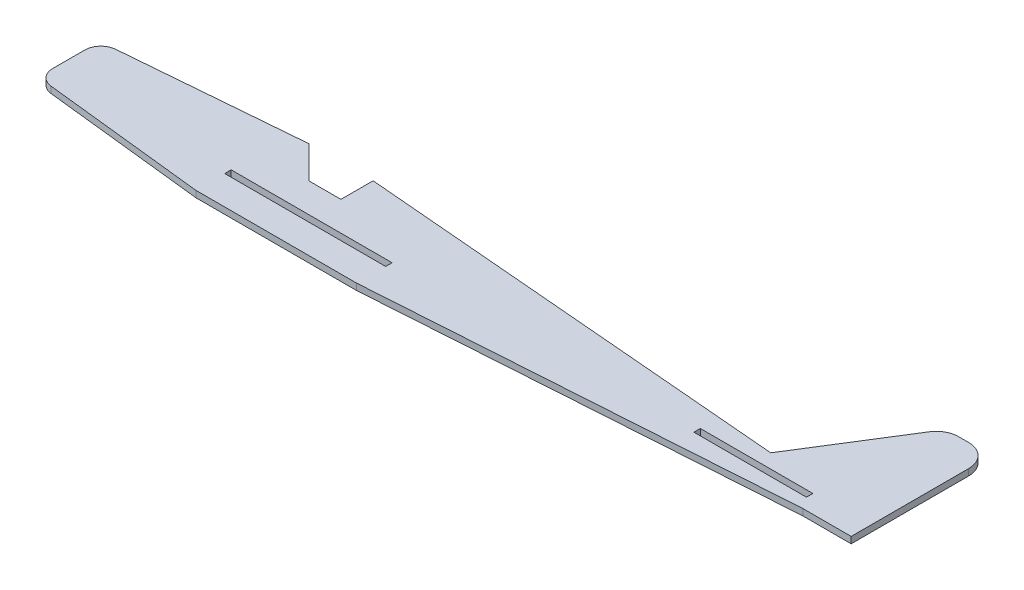
ISO-10303-21;
HEADER;
FILE_DESCRIPTION(('STEP AP214'),'2;1');
FILE_NAME('part.step','',(''),(''),'','','');
FILE_SCHEMA(('AUTOMOTIVE_DESIGN { 1 0 10303 214 1 1 1 1 }'));
ENDSEC;
DATA;
#1=APPLICATION_CONTEXT('core data for automotive mechanical design processes');
#2=APPLICATION_PROTOCOL_DEFINITION('international standard','automotive_design',2000,#1);
#3=PRODUCT_CONTEXT('',#1,'mechanical');
#4=PRODUCT('Part','Part','',(#3));
#5=PRODUCT_RELATED_PRODUCT_CATEGORY('part','',(#4));
#6=PRODUCT_DEFINITION_FORMATION('','',#4);
#7=PRODUCT_DEFINITION_CONTEXT('part definition',#1,'design');
#8=PRODUCT_DEFINITION('design','',#6,#7);
#9=PRODUCT_DEFINITION_SHAPE('','',#8);
#10=(LENGTH_UNIT() NAMED_UNIT(*) SI_UNIT(.MILLI.,.METRE.));
#11=(NAMED_UNIT(*) PLANE_ANGLE_UNIT() SI_UNIT($,.RADIAN.));
#12=(NAMED_UNIT(*) SI_UNIT($,.STERADIAN.) SOLID_ANGLE_UNIT());
#13=UNCERTAINTY_MEASURE_WITH_UNIT(LENGTH_MEASURE(1.E-05),#10,'distance_accuracy_value','');
#14=(GEOMETRIC_REPRESENTATION_CONTEXT(3) GLOBAL_UNCERTAINTY_ASSIGNED_CONTEXT((#13)) GLOBAL_UNIT_ASSIGNED_CONTEXT((#10,
#11,#12)) REPRESENTATION_CONTEXT('',''));
#15=CARTESIAN_POINT('',(0.,0.,0.));
#16=DIRECTION('',(0.,0.,1.));
#17=DIRECTION('',(1.,0.,0.));
#18=AXIS2_PLACEMENT_3D('',#15,#16,#17);
#19=CARTESIAN_POINT('',(-119.990311194996,2.,-5.85764110338988));
#20=DIRECTION('',(0.,1.,0.));
#21=DIRECTION('',(0.,0.,1.));
#22=AXIS2_PLACEMENT_3D('',#19,#20,#21);
#23=PLANE('',#22);
#24=DIRECTION('',(0.,0.,1.));
#25=VECTOR('',#24,1.);
#26=CARTESIAN_POINT('',(72.5096888050036,2.,0.362235571079604));
#27=LINE('',#26,#25);
#28=CARTESIAN_POINT('',(72.5096888050036,2.,0.362235571079604));
#29=VERTEX_POINT('',#28);
#30=CARTESIAN_POINT('',(72.5096888050037,2.,2.3622355710796));
#31=VERTEX_POINT('',#30);
#32=EDGE_CURVE('E61',#29,#31,#27,.T.);
#33=ORIENTED_EDGE('',*,*,#32,.F.);
#34=DIRECTION('',(-1.,0.,0.));
#35=VECTOR('',#34,1.);
#36=CARTESIAN_POINT('',(72.5096888050036,2.,0.362235571079604));
#37=LINE('',#36,#35);
#38=CARTESIAN_POINT('',(107.509688805004,2.,0.362235571079604));
#39=VERTEX_POINT('',#38);
#40=EDGE_CURVE('E234',#39,#29,#37,.T.);
#41=ORIENTED_EDGE('',*,*,#40,.F.);
#42=DIRECTION('',(0.,0.,-1.));
#43=VECTOR('',#42,1.);
#44=CARTESIAN_POINT('',(107.509688805004,2.,0.362235571079604));
#45=LINE('',#44,#43);
#46=CARTESIAN_POINT('',(107.509688805004,2.,2.3622355710796));
#47=VERTEX_POINT('',#46);
#48=EDGE_CURVE('E238',#47,#39,#45,.T.);
#49=ORIENTED_EDGE('',*,*,#48,.F.);
#50=DIRECTION('',(1.,0.,0.));
#51=VECTOR('',#50,1.);
#52=CARTESIAN_POINT('',(72.5096888050036,2.,2.3622355710796));
#53=LINE('',#52,#51);
#54=EDGE_CURVE('E247',#31,#47,#53,.T.);
#55=ORIENTED_EDGE('',*,*,#54,.F.);
#56=EDGE_LOOP('',(#33,#41,#49,#55));
#57=FACE_BOUND('',#56,.T.);
#58=CARTESIAN_POINT('',(-119.990311194996,2.,-5.85764110338988));
#59=DIRECTION('',(0.,1.,0.));
#60=DIRECTION('',(0.,0.,1.));
#61=AXIS2_PLACEMENT_3D('',#58,#59,#60);
#62=CIRCLE('',#61,5.);
#63=CARTESIAN_POINT('',(-120.405540847104,2.,-10.8403697068772));
#64=VERTEX_POINT('',#63);
#65=CARTESIAN_POINT('',(-124.990311194996,2.,-5.85764110338988));
#66=VERTEX_POINT('',#65);
#67=EDGE_CURVE('E305',#64,#66,#62,.T.);
#68=ORIENTED_EDGE('',*,*,#67,.T.);
#69=DIRECTION('',(0.,0.,1.));
#70=VECTOR('',#69,1.);
#71=CARTESIAN_POINT('',(-124.990311194996,2.,-5.85764110338988));
#72=LINE('',#71,#70);
#73=CARTESIAN_POINT('',(-124.990311194996,2.,4.14235889661012));
#74=VERTEX_POINT('',#73);
#75=EDGE_CURVE('E309',#66,#74,#72,.T.);
#76=ORIENTED_EDGE('',*,*,#75,.T.);
#77=CARTESIAN_POINT('',(-119.990311194996,2.,4.14235889661012));
#78=DIRECTION('',(0.,1.,0.));
#79=DIRECTION('',(0.,0.,-1.));
#80=AXIS2_PLACEMENT_3D('',#77,#78,#79);
#81=CIRCLE('',#80,5.);
#82=CARTESIAN_POINT('',(-120.534992277664,2.,9.1126026047379));
#83=VERTEX_POINT('',#82);
#84=EDGE_CURVE('E313',#74,#83,#81,.T.);
#85=ORIENTED_EDGE('',*,*,#84,.T.);
#86=DIRECTION('',(0.994048741625555,0.,0.108936216533575));
#87=VECTOR('',#86,1.);
#88=CARTESIAN_POINT('',(-120.534992277664,2.,9.1126026047379));
#89=LINE('',#88,#87);
#90=CARTESIAN_POINT('',(-69.9903111949962,2.,14.6517136085282));
#91=VERTEX_POINT('',#90);
#92=EDGE_CURVE('E316',#83,#91,#89,.T.);
#93=ORIENTED_EDGE('',*,*,#92,.T.);
#94=DIRECTION('',(1.,0.,0.));
#95=VECTOR('',#94,1.);
#96=CARTESIAN_POINT('',(-69.9903111949962,2.,14.6517136085282));
#97=LINE('',#96,#95);
#98=CARTESIAN_POINT('',(-19.9903111949962,2.,14.6517136085282));
#99=VERTEX_POINT('',#98);
#100=EDGE_CURVE('E319',#91,#99,#97,.T.);
#101=ORIENTED_EDGE('',*,*,#100,.T.);
#102=DIRECTION('',(0.997779730338741,0.,-0.066600373310887));
#103=VECTOR('',#102,1.);
#104=CARTESIAN_POINT('',(-19.9903111949962,2.,14.6517136085282));
#105=LINE('',#104,#103);
#106=CARTESIAN_POINT('',(110.009688805004,2.,5.97439909996834));
#107=VERTEX_POINT('',#106);
#108=EDGE_CURVE('E322',#99,#107,#105,.T.);
#109=ORIENTED_EDGE('',*,*,#108,.T.);
#110=DIRECTION('',(1.,0.,0.));
#111=VECTOR('',#110,1.);
#112=CARTESIAN_POINT('',(110.009688805004,2.,5.97439909996834));
#113=LINE('',#112,#111);
#114=CARTESIAN_POINT('',(125.009688805004,2.,5.97439909996834));
#115=VERTEX_POINT('',#114);
#116=EDGE_CURVE('E325',#107,#115,#113,.T.);
#117=ORIENTED_EDGE('',*,*,#116,.T.);
#118=DIRECTION('',(0.,0.,-1.));
#119=VECTOR('',#118,1.);
#120=CARTESIAN_POINT('',(125.009688805004,2.,-15.5627847089721));
#121=LINE('',#120,#119);
#122=CARTESIAN_POINT('',(125.009688805004,2.,-30.5627847089721));
#123=VERTEX_POINT('',#122);
#124=EDGE_CURVE('E328',#115,#123,#121,.T.);
#125=ORIENTED_EDGE('',*,*,#124,.T.);
#126=CARTESIAN_POINT('',(118.009688805004,2.,-30.5627847089721));
#127=DIRECTION('',(0.,1.,0.));
#128=DIRECTION('',(0.,0.,1.));
#129=AXIS2_PLACEMENT_3D('',#126,#127,#128);
#130=CIRCLE('',#129,7.);
#131=CARTESIAN_POINT('',(118.009688805004,2.,-37.5627847089721));
#132=VERTEX_POINT('',#131);
#133=EDGE_CURVE('E331',#123,#132,#130,.T.);
#134=ORIENTED_EDGE('',*,*,#133,.T.);
#135=DIRECTION('',(-1.,0.,0.));
#136=VECTOR('',#135,1.);
#137=CARTESIAN_POINT('',(118.009688805004,2.,-37.5627847089721));
#138=LINE('',#137,#136);
#139=CARTESIAN_POINT('',(114.885573789805,2.,-37.5627847089721));
#140=VERTEX_POINT('',#139);
#141=EDGE_CURVE('E334',#132,#140,#138,.T.);
#142=ORIENTED_EDGE('',*,*,#141,.T.);
#143=CARTESIAN_POINT('',(114.885573789805,2.,-30.5627847089721));
#144=DIRECTION('',(0.,1.,0.));
#145=DIRECTION('',(0.,0.,1.));
#146=AXIS2_PLACEMENT_3D('',#143,#144,#145);
#147=CIRCLE('',#146,7.);
#148=CARTESIAN_POINT('',(108.952709234816,2.,-34.2777703310374));
#149=VERTEX_POINT('',#148);
#150=EDGE_CURVE('E337',#140,#149,#147,.T.);
#151=ORIENTED_EDGE('',*,*,#150,.T.);
#152=DIRECTION('',(-0.530712231723614,0.,0.847552079284182));
#153=VECTOR('',#152,1.);
#154=CARTESIAN_POINT('',(108.952709234816,2.,-34.2777703310374));
#155=LINE('',#154,#153);
#156=CARTESIAN_POINT('',(90.0096888050036,2.,-4.02560090003167));
#157=VERTEX_POINT('',#156);
#158=EDGE_CURVE('E340',#149,#157,#155,.T.);
#159=ORIENTED_EDGE('',*,*,#158,.T.);
#160=DIRECTION('',(-0.996433239355197,0.,-0.0843848298458275));
#161=VECTOR('',#160,1.);
#162=CARTESIAN_POINT('',(90.0096888050036,2.,-4.02560090003167));
#163=LINE('',#162,#161);
#164=CARTESIAN_POINT('',(-44.9903111949964,2.,-15.4583307400745));
#165=VERTEX_POINT('',#164);
#166=EDGE_CURVE('E343',#157,#165,#163,.T.);
#167=ORIENTED_EDGE('',*,*,#166,.T.);
#168=DIRECTION('',(0.,0.,1.));
#169=VECTOR('',#168,1.);
#170=CARTESIAN_POINT('',(-44.9903111949964,2.,-15.4583307400745));
#171=LINE('',#170,#169);
#172=CARTESIAN_POINT('',(-44.9903111949964,2.,-5.45833074007451));
#173=VERTEX_POINT('',#172);
#174=EDGE_CURVE('E346',#165,#173,#171,.T.);
#175=ORIENTED_EDGE('',*,*,#174,.T.);
#176=DIRECTION('',(-1.,0.,0.));
#177=VECTOR('',#176,1.);
#178=CARTESIAN_POINT('',(-44.9903111949964,2.,-5.45833074007451));
#179=LINE('',#178,#177);
#180=CARTESIAN_POINT('',(-54.9903111949964,2.,-5.45833074007451));
#181=VERTEX_POINT('',#180);
#182=EDGE_CURVE('E349',#173,#181,#179,.T.);
#183=ORIENTED_EDGE('',*,*,#182,.T.);
#184=DIRECTION('',(-0.707106781186546,0.,-0.707106781186549));
#185=VECTOR('',#184,1.);
#186=CARTESIAN_POINT('',(-54.9903111949964,2.,-5.45833074007451));
#187=LINE('',#186,#185);
#188=CARTESIAN_POINT('',(-64.9903111949963,2.,-15.4583307400745));
#189=VERTEX_POINT('',#188);
#190=EDGE_CURVE('E352',#181,#189,#187,.T.);
#191=ORIENTED_EDGE('',*,*,#190,.T.);
#192=DIRECTION('',(-0.996545720697464,0.,0.0830459304215011));
#193=VECTOR('',#192,1.);
#194=CARTESIAN_POINT('',(-120.405540847104,2.,-10.8403697068772));
#195=LINE('',#194,#193);
#196=EDGE_CURVE('E355',#189,#64,#195,.T.);
#197=ORIENTED_EDGE('',*,*,#196,.T.);
#198=EDGE_LOOP('',(#68,#76,#85,#93,#101,#109,#117,#125,#134,#142,#151,#159,#167,#175,#183,#191,#197));
#199=FACE_BOUND('',#198,.T.);
#200=DIRECTION('',(1.,0.,0.));
#201=VECTOR('',#200,1.);
#202=CARTESIAN_POINT('',(-69.9903111949962,2.,5.65171360852821));
#203=LINE('',#202,#201);
#204=CARTESIAN_POINT('',(-69.9903111949962,2.,5.65171360852821));
#205=VERTEX_POINT('',#204);
#206=CARTESIAN_POINT('',(-19.9903111949962,2.,5.65171360852821));
#207=VERTEX_POINT('',#206);
#208=EDGE_CURVE('E265',#205,#207,#203,.T.);
#209=ORIENTED_EDGE('',*,*,#208,.F.);
#210=DIRECTION('',(0.,0.,1.));
#211=VECTOR('',#210,1.);
#212=CARTESIAN_POINT('',(-69.9903111949962,2.,3.65171360852821));
#213=LINE('',#212,#211);
#214=CARTESIAN_POINT('',(-69.9903111949962,2.,3.65171360852821));
#215=VERTEX_POINT('',#214);
#216=EDGE_CURVE('E262',#215,#205,#213,.T.);
#217=ORIENTED_EDGE('',*,*,#216,.F.);
#218=DIRECTION('',(-1.,0.,0.));
#219=VECTOR('',#218,1.);
#220=CARTESIAN_POINT('',(-69.9903111949962,2.,3.65171360852821));
#221=LINE('',#220,#219);
#222=CARTESIAN_POINT('',(-19.9903111949962,2.,3.65171360852821));
#223=VERTEX_POINT('',#222);
#224=EDGE_CURVE('E273',#223,#215,#221,.T.);
#225=ORIENTED_EDGE('',*,*,#224,.F.);
#226=DIRECTION('',(0.,0.,-1.));
#227=VECTOR('',#226,1.);
#228=CARTESIAN_POINT('',(-19.9903111949962,2.,3.65171360852821));
#229=LINE('',#228,#227);
#230=EDGE_CURVE('E269',#207,#223,#229,.T.);
#231=ORIENTED_EDGE('',*,*,#230,.F.);
#232=EDGE_LOOP('',(#209,#217,#225,#231));
#233=FACE_BOUND('',#232,.T.);
#234=ADVANCED_FACE('F45',(#57,#199,#233),#23,.T.);
#235=CARTESIAN_POINT('',(-119.990311194996,0.,-5.85764110338988));
#236=DIRECTION('',(0.,1.,0.));
#237=DIRECTION('',(0.,0.,1.));
#238=AXIS2_PLACEMENT_3D('',#235,#236,#237);
#239=PLANE('',#238);
#240=DIRECTION('',(-1.,0.,0.));
#241=VECTOR('',#240,1.);
#242=CARTESIAN_POINT('',(72.5096888050036,0.,0.362235571079604));
#243=LINE('',#242,#241);
#244=CARTESIAN_POINT('',(107.509688805004,0.,0.362235571079604));
#245=VERTEX_POINT('',#244);
#246=CARTESIAN_POINT('',(72.5096888050036,0.,0.362235571079604));
#247=VERTEX_POINT('',#246);
#248=EDGE_CURVE('E222',#245,#247,#243,.T.);
#249=ORIENTED_EDGE('',*,*,#248,.T.);
#250=DIRECTION('',(0.,0.,1.));
#251=VECTOR('',#250,1.);
#252=CARTESIAN_POINT('',(72.5096888050036,0.,0.362235571079604));
#253=LINE('',#252,#251);
#254=CARTESIAN_POINT('',(72.5096888050036,0.,2.3622355710796));
#255=VERTEX_POINT('',#254);
#256=EDGE_CURVE('E215',#247,#255,#253,.T.);
#257=ORIENTED_EDGE('',*,*,#256,.T.);
#258=DIRECTION('',(1.,0.,0.));
#259=VECTOR('',#258,1.);
#260=CARTESIAN_POINT('',(72.5096888050036,0.,2.3622355710796));
#261=LINE('',#260,#259);
#262=CARTESIAN_POINT('',(107.509688805004,0.,2.3622355710796));
#263=VERTEX_POINT('',#262);
#264=EDGE_CURVE('E225',#255,#263,#261,.T.);
#265=ORIENTED_EDGE('',*,*,#264,.T.);
#266=DIRECTION('',(0.,0.,-1.));
#267=VECTOR('',#266,1.);
#268=CARTESIAN_POINT('',(107.509688805004,0.,0.362235571079604));
#269=LINE('',#268,#267);
#270=EDGE_CURVE('E69',#263,#245,#269,.T.);
#271=ORIENTED_EDGE('',*,*,#270,.T.);
#272=EDGE_LOOP('',(#249,#257,#265,#271));
#273=FACE_BOUND('',#272,.T.);
#274=CARTESIAN_POINT('',(-119.990311194996,0.,-5.85764110338988));
#275=DIRECTION('',(0.,1.,0.));
#276=DIRECTION('',(0.,0.,1.));
#277=AXIS2_PLACEMENT_3D('',#274,#275,#276);
#278=CIRCLE('',#277,5.);
#279=CARTESIAN_POINT('',(-120.405540847104,0.,-10.8403697068772));
#280=VERTEX_POINT('',#279);
#281=CARTESIAN_POINT('',(-124.990311194996,0.,-5.85764110338988));
#282=VERTEX_POINT('',#281);
#283=EDGE_CURVE('E304',#280,#282,#278,.T.);
#284=ORIENTED_EDGE('',*,*,#283,.F.);
#285=DIRECTION('',(-0.996545720697464,0.,0.0830459304215011));
#286=VECTOR('',#285,1.);
#287=CARTESIAN_POINT('',(-120.405540847104,0.,-10.8403697068772));
#288=LINE('',#287,#286);
#289=CARTESIAN_POINT('',(-64.9903111949963,0.,-15.4583307400745));
#290=VERTEX_POINT('',#289);
#291=EDGE_CURVE('E310',#290,#280,#288,.T.);
#292=ORIENTED_EDGE('',*,*,#291,.F.);
#293=DIRECTION('',(-0.707106781186546,0.,-0.707106781186549));
#294=VECTOR('',#293,1.);
#295=CARTESIAN_POINT('',(-54.9903111949964,0.,-5.45833074007451));
#296=LINE('',#295,#294);
#297=CARTESIAN_POINT('',(-54.9903111949964,0.,-5.45833074007451));
#298=VERTEX_POINT('',#297);
#299=EDGE_CURVE('E405',#298,#290,#296,.T.);
#300=ORIENTED_EDGE('',*,*,#299,.F.);
#301=DIRECTION('',(-1.,0.,0.));
#302=VECTOR('',#301,1.);
#303=CARTESIAN_POINT('',(-44.9903111949964,0.,-5.45833074007451));
#304=LINE('',#303,#302);
#305=CARTESIAN_POINT('',(-44.9903111949964,0.,-5.45833074007451));
#306=VERTEX_POINT('',#305);
#307=EDGE_CURVE('E402',#306,#298,#304,.T.);
#308=ORIENTED_EDGE('',*,*,#307,.F.);
#309=DIRECTION('',(0.,0.,1.));
#310=VECTOR('',#309,1.);
#311=CARTESIAN_POINT('',(-44.9903111949964,0.,-15.4583307400745));
#312=LINE('',#311,#310);
#313=CARTESIAN_POINT('',(-44.9903111949964,0.,-15.4583307400745));
#314=VERTEX_POINT('',#313);
#315=EDGE_CURVE('E399',#314,#306,#312,.T.);
#316=ORIENTED_EDGE('',*,*,#315,.F.);
#317=DIRECTION('',(-0.996433239355197,0.,-0.0843848298458275));
#318=VECTOR('',#317,1.);
#319=CARTESIAN_POINT('',(90.0096888050036,0.,-4.02560090003167));
#320=LINE('',#319,#318);
#321=CARTESIAN_POINT('',(90.0096888050036,0.,-4.02560090003167));
#322=VERTEX_POINT('',#321);
#323=EDGE_CURVE('E396',#322,#314,#320,.T.);
#324=ORIENTED_EDGE('',*,*,#323,.F.);
#325=DIRECTION('',(-0.530712231723614,0.,0.847552079284182));
#326=VECTOR('',#325,1.);
#327=CARTESIAN_POINT('',(108.952709234816,0.,-34.2777703310374));
#328=LINE('',#327,#326);
#329=CARTESIAN_POINT('',(108.952709234816,0.,-34.2777703310374));
#330=VERTEX_POINT('',#329);
#331=EDGE_CURVE('E393',#330,#322,#328,.T.);
#332=ORIENTED_EDGE('',*,*,#331,.F.);
#333=CARTESIAN_POINT('',(114.885573789805,0.,-30.5627847089721));
#334=DIRECTION('',(0.,1.,0.));
#335=DIRECTION('',(0.,0.,1.));
#336=AXIS2_PLACEMENT_3D('',#333,#334,#335);
#337=CIRCLE('',#336,7.);
#338=CARTESIAN_POINT('',(114.885573789805,0.,-37.5627847089721));
#339=VERTEX_POINT('',#338);
#340=EDGE_CURVE('E390',#339,#330,#337,.T.);
#341=ORIENTED_EDGE('',*,*,#340,.F.);
#342=DIRECTION('',(-1.,0.,0.));
#343=VECTOR('',#342,1.);
#344=CARTESIAN_POINT('',(118.009688805004,0.,-37.5627847089721));
#345=LINE('',#344,#343);
#346=CARTESIAN_POINT('',(118.009688805004,0.,-37.5627847089721));
#347=VERTEX_POINT('',#346);
#348=EDGE_CURVE('E387',#347,#339,#345,.T.);
#349=ORIENTED_EDGE('',*,*,#348,.F.);
#350=CARTESIAN_POINT('',(118.009688805004,0.,-30.5627847089721));
#351=DIRECTION('',(0.,1.,0.));
#352=DIRECTION('',(0.,0.,1.));
#353=AXIS2_PLACEMENT_3D('',#350,#351,#352);
#354=CIRCLE('',#353,7.);
#355=CARTESIAN_POINT('',(125.009688805004,0.,-30.5627847089721));
#356=VERTEX_POINT('',#355);
#357=EDGE_CURVE('E384',#356,#347,#354,.T.);
#358=ORIENTED_EDGE('',*,*,#357,.F.);
#359=DIRECTION('',(0.,0.,-1.));
#360=VECTOR('',#359,1.);
#361=CARTESIAN_POINT('',(125.009688805004,0.,-15.5627847089721));
#362=LINE('',#361,#360);
#363=CARTESIAN_POINT('',(125.009688805004,0.,5.97439909996834));
#364=VERTEX_POINT('',#363);
#365=EDGE_CURVE('E381',#364,#356,#362,.T.);
#366=ORIENTED_EDGE('',*,*,#365,.F.);
#367=DIRECTION('',(1.,0.,0.));
#368=VECTOR('',#367,1.);
#369=CARTESIAN_POINT('',(110.009688805004,0.,5.97439909996834));
#370=LINE('',#369,#368);
#371=CARTESIAN_POINT('',(110.009688805004,0.,5.97439909996834));
#372=VERTEX_POINT('',#371);
#373=EDGE_CURVE('E377',#372,#364,#370,.T.);
#374=ORIENTED_EDGE('',*,*,#373,.F.);
#375=DIRECTION('',(0.997779730338741,0.,-0.066600373310887));
#376=VECTOR('',#375,1.);
#377=CARTESIAN_POINT('',(-19.9903111949962,0.,14.6517136085282));
#378=LINE('',#377,#376);
#379=CARTESIAN_POINT('',(-19.9903111949962,0.,14.6517136085282));
#380=VERTEX_POINT('',#379);
#381=EDGE_CURVE('E374',#380,#372,#378,.T.);
#382=ORIENTED_EDGE('',*,*,#381,.F.);
#383=DIRECTION('',(1.,0.,0.));
#384=VECTOR('',#383,1.);
#385=CARTESIAN_POINT('',(-69.9903111949962,0.,14.6517136085282));
#386=LINE('',#385,#384);
#387=CARTESIAN_POINT('',(-69.9903111949962,0.,14.6517136085282));
#388=VERTEX_POINT('',#387);
#389=EDGE_CURVE('E371',#388,#380,#386,.T.);
#390=ORIENTED_EDGE('',*,*,#389,.F.);
#391=DIRECTION('',(0.994048741625555,0.,0.108936216533575));
#392=VECTOR('',#391,1.);
#393=CARTESIAN_POINT('',(-120.534992277664,0.,9.1126026047379));
#394=LINE('',#393,#392);
#395=CARTESIAN_POINT('',(-120.534992277664,0.,9.1126026047379));
#396=VERTEX_POINT('',#395);
#397=EDGE_CURVE('E368',#396,#388,#394,.T.);
#398=ORIENTED_EDGE('',*,*,#397,.F.);
#399=CARTESIAN_POINT('',(-119.990311194996,0.,4.14235889661012));
#400=DIRECTION('',(0.,1.,0.));
#401=DIRECTION('',(0.,0.,-1.));
#402=AXIS2_PLACEMENT_3D('',#399,#400,#401);
#403=CIRCLE('',#402,5.);
#404=CARTESIAN_POINT('',(-124.990311194996,0.,4.14235889661012));
#405=VERTEX_POINT('',#404);
#406=EDGE_CURVE('E365',#405,#396,#403,.T.);
#407=ORIENTED_EDGE('',*,*,#406,.F.);
#408=DIRECTION('',(0.,0.,1.));
#409=VECTOR('',#408,1.);
#410=CARTESIAN_POINT('',(-124.990311194996,0.,-5.85764110338988));
#411=LINE('',#410,#409);
#412=EDGE_CURVE('E362',#282,#405,#411,.T.);
#413=ORIENTED_EDGE('',*,*,#412,.F.);
#414=EDGE_LOOP('',(#284,#292,#300,#308,#316,#324,#332,#341,#349,#358,#366,#374,#382,#390,#398,
#407,#413));
#415=FACE_BOUND('',#414,.T.);
#416=DIRECTION('',(0.,0.,1.));
#417=VECTOR('',#416,1.);
#418=CARTESIAN_POINT('',(-69.9903111949962,0.,3.65171360852821));
#419=LINE('',#418,#417);
#420=CARTESIAN_POINT('',(-69.9903111949962,0.,3.65171360852821));
#421=VERTEX_POINT('',#420);
#422=CARTESIAN_POINT('',(-69.9903111949962,0.,5.65171360852821));
#423=VERTEX_POINT('',#422);
#424=EDGE_CURVE('E256',#421,#423,#419,.T.);
#425=ORIENTED_EDGE('',*,*,#424,.T.);
#426=DIRECTION('',(1.,0.,0.));
#427=VECTOR('',#426,1.);
#428=CARTESIAN_POINT('',(-69.9903111949962,0.,5.65171360852821));
#429=LINE('',#428,#427);
#430=CARTESIAN_POINT('',(-19.9903111949962,0.,5.65171360852821));
#431=VERTEX_POINT('',#430);
#432=EDGE_CURVE('E280',#423,#431,#429,.T.);
#433=ORIENTED_EDGE('',*,*,#432,.T.);
#434=DIRECTION('',(0.,0.,-1.));
#435=VECTOR('',#434,1.);
#436=CARTESIAN_POINT('',(-19.9903111949962,0.,3.65171360852821));
#437=LINE('',#436,#435);
#438=CARTESIAN_POINT('',(-19.9903111949962,0.,3.65171360852821));
#439=VERTEX_POINT('',#438);
#440=EDGE_CURVE('E284',#431,#439,#437,.T.);
#441=ORIENTED_EDGE('',*,*,#440,.T.);
#442=DIRECTION('',(-1.,0.,0.));
#443=VECTOR('',#442,1.);
#444=CARTESIAN_POINT('',(-69.9903111949962,0.,3.65171360852821));
#445=LINE('',#444,#443);
#446=EDGE_CURVE('E266',#439,#421,#445,.T.);
#447=ORIENTED_EDGE('',*,*,#446,.T.);
#448=EDGE_LOOP('',(#425,#433,#441,#447));
#449=FACE_BOUND('',#448,.T.);
#450=ADVANCED_FACE('F230',(#273,#415,#449),#239,.F.);
#451=CARTESIAN_POINT('',(-119.990311194996,2.,-5.85764110338988));
#452=DIRECTION('',(0.,-1.,0.));
#453=DIRECTION('',(0.,0.,-1.));
#454=AXIS2_PLACEMENT_3D('',#451,#452,#453);
#455=CYLINDRICAL_SURFACE('',#454,5.);
#456=ORIENTED_EDGE('',*,*,#283,.T.);
#457=DIRECTION('',(0.,-1.,0.));
#458=VECTOR('',#457,1.);
#459=CARTESIAN_POINT('',(-124.990311194996,2.,-5.85764110338988));
#460=LINE('',#459,#458);
#461=EDGE_CURVE('E11',#66,#282,#460,.T.);
#462=ORIENTED_EDGE('',*,*,#461,.F.);
#463=ORIENTED_EDGE('',*,*,#67,.F.);
#464=DIRECTION('',(0.,-1.,0.));
#465=VECTOR('',#464,1.);
#466=CARTESIAN_POINT('',(-120.405540847104,2.,-10.8403697068772));
#467=LINE('',#466,#465);
#468=EDGE_CURVE('E358',#64,#280,#467,.T.);
#469=ORIENTED_EDGE('',*,*,#468,.T.);
#470=EDGE_LOOP('',(#456,#462,#463,#469));
#471=FACE_BOUND('',#470,.T.);
#472=ADVANCED_FACE('F47',(#471),#455,.T.);
#473=CARTESIAN_POINT('',(-124.990311194996,2.,-5.85764110338988));
#474=DIRECTION('',(1.,0.,0.));
#475=DIRECTION('',(0.,0.,-1.));
#476=AXIS2_PLACEMENT_3D('',#473,#474,#475);
#477=PLANE('',#476);
#478=ORIENTED_EDGE('',*,*,#412,.T.);
#479=DIRECTION('',(0.,-1.,0.));
#480=VECTOR('',#479,1.);
#481=CARTESIAN_POINT('',(-124.990311194996,2.,4.14235889661012));
#482=LINE('',#481,#480);
#483=EDGE_CURVE('E54',#74,#405,#482,.T.);
#484=ORIENTED_EDGE('',*,*,#483,.F.);
#485=ORIENTED_EDGE('',*,*,#75,.F.);
#486=ORIENTED_EDGE('',*,*,#461,.T.);
#487=EDGE_LOOP('',(#478,#484,#485,#486));
#488=FACE_BOUND('',#487,.T.);
#489=ADVANCED_FACE('F496',(#488),#477,.F.);
#490=CARTESIAN_POINT('',(-119.990311194996,2.,4.14235889661012));
#491=DIRECTION('',(0.,-1.,0.));
#492=DIRECTION('',(0.,0.,-1.));
#493=AXIS2_PLACEMENT_3D('',#490,#491,#492);
#494=CYLINDRICAL_SURFACE('',#493,5.);
#495=ORIENTED_EDGE('',*,*,#406,.T.);
#496=DIRECTION('',(0.,-1.,0.));
#497=VECTOR('',#496,1.);
#498=CARTESIAN_POINT('',(-120.534992277664,2.,9.1126026047379));
#499=LINE('',#498,#497);
#500=EDGE_CURVE('E465',#83,#396,#499,.T.);
#501=ORIENTED_EDGE('',*,*,#500,.F.);
#502=ORIENTED_EDGE('',*,*,#84,.F.);
#503=ORIENTED_EDGE('',*,*,#483,.T.);
#504=EDGE_LOOP('',(#495,#501,#502,#503));
#505=FACE_BOUND('',#504,.T.);
#506=ADVANCED_FACE('F474',(#505),#494,.T.);
#507=CARTESIAN_POINT('',(-120.534992277664,2.,9.1126026047379));
#508=DIRECTION('',(0.108936216533575,0.,-0.994048741625555));
#509=DIRECTION('',(-0.994048741625555,0.,-0.108936216533575));
#510=AXIS2_PLACEMENT_3D('',#507,#508,#509);
#511=PLANE('',#510);
#512=ORIENTED_EDGE('',*,*,#397,.T.);
#513=DIRECTION('',(0.,-1.,0.));
#514=VECTOR('',#513,1.);
#515=CARTESIAN_POINT('',(-69.9903111949962,2.,14.6517136085282));
#516=LINE('',#515,#514);
#517=EDGE_CURVE('E461',#91,#388,#516,.T.);
#518=ORIENTED_EDGE('',*,*,#517,.F.);
#519=ORIENTED_EDGE('',*,*,#92,.F.);
#520=ORIENTED_EDGE('',*,*,#500,.T.);
#521=EDGE_LOOP('',(#512,#518,#519,#520));
#522=FACE_BOUND('',#521,.T.);
#523=ADVANCED_FACE('F484',(#522),#511,.F.);
#524=CARTESIAN_POINT('',(-69.9903111949962,2.,14.6517136085282));
#525=DIRECTION('',(0.,0.,-1.));
#526=DIRECTION('',(-1.,0.,0.));
#527=AXIS2_PLACEMENT_3D('',#524,#525,#526);
#528=PLANE('',#527);
#529=ORIENTED_EDGE('',*,*,#389,.T.);
#530=DIRECTION('',(0.,-1.,0.));
#531=VECTOR('',#530,1.);
#532=CARTESIAN_POINT('',(-19.9903111949962,2.,14.6517136085282));
#533=LINE('',#532,#531);
#534=EDGE_CURVE('E457',#99,#380,#533,.T.);
#535=ORIENTED_EDGE('',*,*,#534,.F.);
#536=ORIENTED_EDGE('',*,*,#100,.F.);
#537=ORIENTED_EDGE('',*,*,#517,.T.);
#538=EDGE_LOOP('',(#529,#535,#536,#537));
#539=FACE_BOUND('',#538,.T.);
#540=ADVANCED_FACE('F488',(#539),#528,.F.);
#541=CARTESIAN_POINT('',(-19.9903111949962,2.,14.6517136085282));
#542=DIRECTION('',(-0.066600373310887,0.,-0.997779730338741));
#543=DIRECTION('',(-0.997779730338741,0.,0.066600373310887));
#544=AXIS2_PLACEMENT_3D('',#541,#542,#543);
#545=PLANE('',#544);
#546=ORIENTED_EDGE('',*,*,#381,.T.);
#547=DIRECTION('',(0.,-1.,0.));
#548=VECTOR('',#547,1.);
#549=CARTESIAN_POINT('',(110.009688805004,2.,5.97439909996834));
#550=LINE('',#549,#548);
#551=EDGE_CURVE('E453',#107,#372,#550,.T.);
#552=ORIENTED_EDGE('',*,*,#551,.F.);
#553=ORIENTED_EDGE('',*,*,#108,.F.);
#554=ORIENTED_EDGE('',*,*,#534,.T.);
#555=EDGE_LOOP('',(#546,#552,#553,#554));
#556=FACE_BOUND('',#555,.T.);
#557=ADVANCED_FACE('F559',(#556),#545,.F.);
#558=CARTESIAN_POINT('',(110.009688805004,2.,5.97439909996834));
#559=DIRECTION('',(0.,0.,-1.));
#560=DIRECTION('',(-1.,0.,0.));
#561=AXIS2_PLACEMENT_3D('',#558,#559,#560);
#562=PLANE('',#561);
#563=ORIENTED_EDGE('',*,*,#373,.T.);
#564=DIRECTION('',(0.,-1.,0.));
#565=VECTOR('',#564,1.);
#566=CARTESIAN_POINT('',(125.009688805004,2.,5.97439909996834));
#567=LINE('',#566,#565);
#568=EDGE_CURVE('E449',#115,#364,#567,.T.);
#569=ORIENTED_EDGE('',*,*,#568,.F.);
#570=ORIENTED_EDGE('',*,*,#116,.F.);
#571=ORIENTED_EDGE('',*,*,#551,.T.);
#572=EDGE_LOOP('',(#563,#569,#570,#571));
#573=FACE_BOUND('',#572,.T.);
#574=ADVANCED_FACE('F548',(#573),#562,.F.);
#575=CARTESIAN_POINT('',(125.009688805004,2.,-15.5627847089721));
#576=DIRECTION('',(-1.,0.,0.));
#577=DIRECTION('',(0.,0.,1.));
#578=AXIS2_PLACEMENT_3D('',#575,#576,#577);
#579=PLANE('',#578);
#580=ORIENTED_EDGE('',*,*,#365,.T.);
#581=DIRECTION('',(0.,-1.,0.));
#582=VECTOR('',#581,1.);
#583=CARTESIAN_POINT('',(125.009688805004,2.,-30.5627847089721));
#584=LINE('',#583,#582);
#585=EDGE_CURVE('E445',#123,#356,#584,.T.);
#586=ORIENTED_EDGE('',*,*,#585,.F.);
#587=ORIENTED_EDGE('',*,*,#124,.F.);
#588=ORIENTED_EDGE('',*,*,#568,.T.);
#589=EDGE_LOOP('',(#580,#586,#587,#588));
#590=FACE_BOUND('',#589,.T.);
#591=ADVANCED_FACE('F551',(#590),#579,.F.);
#592=CARTESIAN_POINT('',(118.009688805004,2.,-30.5627847089721));
#593=DIRECTION('',(0.,-1.,0.));
#594=DIRECTION('',(0.,0.,-1.));
#595=AXIS2_PLACEMENT_3D('',#592,#593,#594);
#596=CYLINDRICAL_SURFACE('',#595,7.);
#597=ORIENTED_EDGE('',*,*,#357,.T.);
#598=DIRECTION('',(0.,-1.,0.));
#599=VECTOR('',#598,1.);
#600=CARTESIAN_POINT('',(118.009688805004,2.,-37.5627847089721));
#601=LINE('',#600,#599);
#602=EDGE_CURVE('E441',#132,#347,#601,.T.);
#603=ORIENTED_EDGE('',*,*,#602,.F.);
#604=ORIENTED_EDGE('',*,*,#133,.F.);
#605=ORIENTED_EDGE('',*,*,#585,.T.);
#606=EDGE_LOOP('',(#597,#603,#604,#605));
#607=FACE_BOUND('',#606,.T.);
#608=ADVANCED_FACE('F542',(#607),#596,.T.);
#609=CARTESIAN_POINT('',(118.009688805004,2.,-37.5627847089721));
#610=DIRECTION('',(0.,0.,1.));
#611=DIRECTION('',(1.,0.,0.));
#612=AXIS2_PLACEMENT_3D('',#609,#610,#611);
#613=PLANE('',#612);
#614=ORIENTED_EDGE('',*,*,#348,.T.);
#615=DIRECTION('',(0.,-1.,0.));
#616=VECTOR('',#615,1.);
#617=CARTESIAN_POINT('',(114.885573789805,2.,-37.5627847089721));
#618=LINE('',#617,#616);
#619=EDGE_CURVE('E437',#140,#339,#618,.T.);
#620=ORIENTED_EDGE('',*,*,#619,.F.);
#621=ORIENTED_EDGE('',*,*,#141,.F.);
#622=ORIENTED_EDGE('',*,*,#602,.T.);
#623=EDGE_LOOP('',(#614,#620,#621,#622));
#624=FACE_BOUND('',#623,.T.);
#625=ADVANCED_FACE('F538',(#624),#613,.F.);
#626=CARTESIAN_POINT('',(114.885573789805,2.,-30.5627847089721));
#627=DIRECTION('',(0.,-1.,0.));
#628=DIRECTION('',(0.,0.,-1.));
#629=AXIS2_PLACEMENT_3D('',#626,#627,#628);
#630=CYLINDRICAL_SURFACE('',#629,7.);
#631=ORIENTED_EDGE('',*,*,#340,.T.);
#632=DIRECTION('',(0.,-1.,0.));
#633=VECTOR('',#632,1.);
#634=CARTESIAN_POINT('',(108.952709234816,2.,-34.2777703310374));
#635=LINE('',#634,#633);
#636=EDGE_CURVE('E433',#149,#330,#635,.T.);
#637=ORIENTED_EDGE('',*,*,#636,.F.);
#638=ORIENTED_EDGE('',*,*,#150,.F.);
#639=ORIENTED_EDGE('',*,*,#619,.T.);
#640=EDGE_LOOP('',(#631,#637,#638,#639));
#641=FACE_BOUND('',#640,.T.);
#642=ADVANCED_FACE('F533',(#641),#630,.T.);
#643=CARTESIAN_POINT('',(108.952709234816,2.,-34.2777703310374));
#644=DIRECTION('',(0.847552079284182,0.,0.530712231723614));
#645=DIRECTION('',(0.530712231723614,0.,-0.847552079284182));
#646=AXIS2_PLACEMENT_3D('',#643,#644,#645);
#647=PLANE('',#646);
#648=ORIENTED_EDGE('',*,*,#331,.T.);
#649=DIRECTION('',(0.,-1.,0.));
#650=VECTOR('',#649,1.);
#651=CARTESIAN_POINT('',(90.0096888050036,2.,-4.02560090003167));
#652=LINE('',#651,#650);
#653=EDGE_CURVE('E429',#157,#322,#652,.T.);
#654=ORIENTED_EDGE('',*,*,#653,.F.);
#655=ORIENTED_EDGE('',*,*,#158,.F.);
#656=ORIENTED_EDGE('',*,*,#636,.T.);
#657=EDGE_LOOP('',(#648,#654,#655,#656));
#658=FACE_BOUND('',#657,.T.);
#659=ADVANCED_FACE('F527',(#658),#647,.F.);
#660=CARTESIAN_POINT('',(90.0096888050036,2.,-4.02560090003167));
#661=DIRECTION('',(-0.0843848298458275,0.,0.996433239355197));
#662=DIRECTION('',(0.996433239355197,0.,0.0843848298458275));
#663=AXIS2_PLACEMENT_3D('',#660,#661,#662);
#664=PLANE('',#663);
#665=ORIENTED_EDGE('',*,*,#323,.T.);
#666=DIRECTION('',(0.,-1.,0.));
#667=VECTOR('',#666,1.);
#668=CARTESIAN_POINT('',(-44.9903111949964,2.,-15.4583307400745));
#669=LINE('',#668,#667);
#670=EDGE_CURVE('E425',#165,#314,#669,.T.);
#671=ORIENTED_EDGE('',*,*,#670,.F.);
#672=ORIENTED_EDGE('',*,*,#166,.F.);
#673=ORIENTED_EDGE('',*,*,#653,.T.);
#674=EDGE_LOOP('',(#665,#671,#672,#673));
#675=FACE_BOUND('',#674,.T.);
#676=ADVANCED_FACE('F523',(#675),#664,.F.);
#677=CARTESIAN_POINT('',(-44.9903111949964,2.,-15.4583307400745));
#678=DIRECTION('',(1.,0.,0.));
#679=DIRECTION('',(0.,0.,-1.));
#680=AXIS2_PLACEMENT_3D('',#677,#678,#679);
#681=PLANE('',#680);
#682=ORIENTED_EDGE('',*,*,#315,.T.);
#683=DIRECTION('',(0.,-1.,0.));
#684=VECTOR('',#683,1.);
#685=CARTESIAN_POINT('',(-44.9903111949964,2.,-5.45833074007451));
#686=LINE('',#685,#684);
#687=EDGE_CURVE('E421',#173,#306,#686,.T.);
#688=ORIENTED_EDGE('',*,*,#687,.F.);
#689=ORIENTED_EDGE('',*,*,#174,.F.);
#690=ORIENTED_EDGE('',*,*,#670,.T.);
#691=EDGE_LOOP('',(#682,#688,#689,#690));
#692=FACE_BOUND('',#691,.T.);
#693=ADVANCED_FACE('F518',(#692),#681,.F.);
#694=CARTESIAN_POINT('',(-44.9903111949964,2.,-5.45833074007451));
#695=DIRECTION('',(0.,0.,1.));
#696=DIRECTION('',(1.,0.,0.));
#697=AXIS2_PLACEMENT_3D('',#694,#695,#696);
#698=PLANE('',#697);
#699=ORIENTED_EDGE('',*,*,#307,.T.);
#700=DIRECTION('',(0.,-1.,0.));
#701=VECTOR('',#700,1.);
#702=CARTESIAN_POINT('',(-54.9903111949964,2.,-5.45833074007451));
#703=LINE('',#702,#701);
#704=EDGE_CURVE('E417',#181,#298,#703,.T.);
#705=ORIENTED_EDGE('',*,*,#704,.F.);
#706=ORIENTED_EDGE('',*,*,#182,.F.);
#707=ORIENTED_EDGE('',*,*,#687,.T.);
#708=EDGE_LOOP('',(#699,#705,#706,#707));
#709=FACE_BOUND('',#708,.T.);
#710=ADVANCED_FACE('F512',(#709),#698,.F.);
#711=CARTESIAN_POINT('',(-54.9903111949964,2.,-5.45833074007451));
#712=DIRECTION('',(-0.707106781186549,0.,0.707106781186546));
#713=DIRECTION('',(0.707106781186546,0.,0.707106781186549));
#714=AXIS2_PLACEMENT_3D('',#711,#712,#713);
#715=PLANE('',#714);
#716=ORIENTED_EDGE('',*,*,#299,.T.);
#717=DIRECTION('',(0.,-1.,0.));
#718=VECTOR('',#717,1.);
#719=CARTESIAN_POINT('',(-64.9903111949963,2.,-15.4583307400745));
#720=LINE('',#719,#718);
#721=EDGE_CURVE('E413',#189,#290,#720,.T.);
#722=ORIENTED_EDGE('',*,*,#721,.F.);
#723=ORIENTED_EDGE('',*,*,#190,.F.);
#724=ORIENTED_EDGE('',*,*,#704,.T.);
#725=EDGE_LOOP('',(#716,#722,#723,#724));
#726=FACE_BOUND('',#725,.T.);
#727=ADVANCED_FACE('F508',(#726),#715,.F.);
#728=CARTESIAN_POINT('',(-120.405540847104,2.,-10.8403697068772));
#729=DIRECTION('',(0.0830459304215011,0.,0.996545720697464));
#730=DIRECTION('',(0.996545720697464,0.,-0.0830459304215011));
#731=AXIS2_PLACEMENT_3D('',#728,#729,#730);
#732=PLANE('',#731);
#733=ORIENTED_EDGE('',*,*,#291,.T.);
#734=ORIENTED_EDGE('',*,*,#468,.F.);
#735=ORIENTED_EDGE('',*,*,#196,.F.);
#736=ORIENTED_EDGE('',*,*,#721,.T.);
#737=EDGE_LOOP('',(#733,#734,#735,#736));
#738=FACE_BOUND('',#737,.T.);
#739=ADVANCED_FACE('F503',(#738),#732,.F.);
#740=CARTESIAN_POINT('',(-69.9903111949962,2.,3.65171360852821));
#741=DIRECTION('',(1.,0.,0.));
#742=DIRECTION('',(0.,0.,-1.));
#743=AXIS2_PLACEMENT_3D('',#740,#741,#742);
#744=PLANE('',#743);
#745=ORIENTED_EDGE('',*,*,#424,.F.);
#746=DIRECTION('',(0.,-1.,0.));
#747=VECTOR('',#746,1.);
#748=CARTESIAN_POINT('',(-69.9903111949962,2.,3.65171360852821));
#749=LINE('',#748,#747);
#750=EDGE_CURVE('E276',#215,#421,#749,.T.);
#751=ORIENTED_EDGE('',*,*,#750,.F.);
#752=ORIENTED_EDGE('',*,*,#216,.T.);
#753=DIRECTION('',(0.,-1.,0.));
#754=VECTOR('',#753,1.);
#755=CARTESIAN_POINT('',(-69.9903111949962,2.,5.65171360852821));
#756=LINE('',#755,#754);
#757=EDGE_CURVE('E300',#205,#423,#756,.T.);
#758=ORIENTED_EDGE('',*,*,#757,.T.);
#759=EDGE_LOOP('',(#745,#751,#752,#758));
#760=FACE_BOUND('',#759,.T.);
#761=ADVANCED_FACE('F570',(#760),#744,.T.);
#762=CARTESIAN_POINT('',(-69.9903111949962,2.,5.65171360852821));
#763=DIRECTION('',(0.,0.,-1.));
#764=DIRECTION('',(-1.,0.,0.));
#765=AXIS2_PLACEMENT_3D('',#762,#763,#764);
#766=PLANE('',#765);
#767=ORIENTED_EDGE('',*,*,#432,.F.);
#768=ORIENTED_EDGE('',*,*,#757,.F.);
#769=ORIENTED_EDGE('',*,*,#208,.T.);
#770=DIRECTION('',(0.,-1.,0.));
#771=VECTOR('',#770,1.);
#772=CARTESIAN_POINT('',(-19.9903111949962,2.,5.65171360852821));
#773=LINE('',#772,#771);
#774=EDGE_CURVE('E297',#207,#431,#773,.T.);
#775=ORIENTED_EDGE('',*,*,#774,.T.);
#776=EDGE_LOOP('',(#767,#768,#769,#775));
#777=FACE_BOUND('',#776,.T.);
#778=ADVANCED_FACE('F634',(#777),#766,.T.);
#779=CARTESIAN_POINT('',(-19.9903111949962,2.,3.65171360852821));
#780=DIRECTION('',(-1.,0.,0.));
#781=DIRECTION('',(0.,0.,1.));
#782=AXIS2_PLACEMENT_3D('',#779,#780,#781);
#783=PLANE('',#782);
#784=ORIENTED_EDGE('',*,*,#440,.F.);
#785=ORIENTED_EDGE('',*,*,#774,.F.);
#786=ORIENTED_EDGE('',*,*,#230,.T.);
#787=DIRECTION('',(0.,-1.,0.));
#788=VECTOR('',#787,1.);
#789=CARTESIAN_POINT('',(-19.9903111949962,2.,3.65171360852821));
#790=LINE('',#789,#788);
#791=EDGE_CURVE('E294',#223,#439,#790,.T.);
#792=ORIENTED_EDGE('',*,*,#791,.T.);
#793=EDGE_LOOP('',(#784,#785,#786,#792));
#794=FACE_BOUND('',#793,.T.);
#795=ADVANCED_FACE('F642',(#794),#783,.T.);
#796=CARTESIAN_POINT('',(-69.9903111949962,2.,3.65171360852821));
#797=DIRECTION('',(0.,0.,1.));
#798=DIRECTION('',(1.,0.,0.));
#799=AXIS2_PLACEMENT_3D('',#796,#797,#798);
#800=PLANE('',#799);
#801=ORIENTED_EDGE('',*,*,#446,.F.);
#802=ORIENTED_EDGE('',*,*,#791,.F.);
#803=ORIENTED_EDGE('',*,*,#224,.T.);
#804=ORIENTED_EDGE('',*,*,#750,.T.);
#805=EDGE_LOOP('',(#801,#802,#803,#804));
#806=FACE_BOUND('',#805,.T.);
#807=ADVANCED_FACE('F649',(#806),#800,.T.);
#808=CARTESIAN_POINT('',(72.5096888050036,0.,0.362235571079604));
#809=DIRECTION('',(-1.,0.,0.));
#810=DIRECTION('',(0.,0.,1.));
#811=AXIS2_PLACEMENT_3D('',#808,#809,#810);
#812=PLANE('',#811);
#813=ORIENTED_EDGE('',*,*,#32,.T.);
#814=DIRECTION('',(0.,1.,0.));
#815=VECTOR('',#814,1.);
#816=CARTESIAN_POINT('',(72.5096888050036,0.,2.3622355710796));
#817=LINE('',#816,#815);
#818=EDGE_CURVE('E211',#255,#31,#817,.T.);
#819=ORIENTED_EDGE('',*,*,#818,.F.);
#820=ORIENTED_EDGE('',*,*,#256,.F.);
#821=DIRECTION('',(0.,1.,0.));
#822=VECTOR('',#821,1.);
#823=CARTESIAN_POINT('',(72.5096888050036,0.,0.362235571079604));
#824=LINE('',#823,#822);
#825=EDGE_CURVE('E253',#247,#29,#824,.T.);
#826=ORIENTED_EDGE('',*,*,#825,.T.);
#827=EDGE_LOOP('',(#813,#819,#820,#826));
#828=FACE_BOUND('',#827,.T.);
#829=ADVANCED_FACE('F213',(#828),#812,.F.);
#830=CARTESIAN_POINT('',(72.5096888050036,0.,0.362235571079604));
#831=DIRECTION('',(0.,0.,-1.));
#832=DIRECTION('',(-1.,0.,0.));
#833=AXIS2_PLACEMENT_3D('',#830,#831,#832);
#834=PLANE('',#833);
#835=ORIENTED_EDGE('',*,*,#40,.T.);
#836=ORIENTED_EDGE('',*,*,#825,.F.);
#837=ORIENTED_EDGE('',*,*,#248,.F.);
#838=DIRECTION('',(0.,1.,0.));
#839=VECTOR('',#838,1.);
#840=CARTESIAN_POINT('',(107.509688805004,0.,0.362235571079604));
#841=LINE('',#840,#839);
#842=EDGE_CURVE('E257',#245,#39,#841,.T.);
#843=ORIENTED_EDGE('',*,*,#842,.T.);
#844=EDGE_LOOP('',(#835,#836,#837,#843));
#845=FACE_BOUND('',#844,.T.);
#846=ADVANCED_FACE('F669',(#845),#834,.F.);
#847=CARTESIAN_POINT('',(107.509688805004,0.,0.362235571079604));
#848=DIRECTION('',(1.,0.,0.));
#849=DIRECTION('',(0.,0.,-1.));
#850=AXIS2_PLACEMENT_3D('',#847,#848,#849);
#851=PLANE('',#850);
#852=ORIENTED_EDGE('',*,*,#48,.T.);
#853=ORIENTED_EDGE('',*,*,#842,.F.);
#854=ORIENTED_EDGE('',*,*,#270,.F.);
#855=DIRECTION('',(0.,1.,0.));
#856=VECTOR('',#855,1.);
#857=CARTESIAN_POINT('',(107.509688805004,0.,2.3622355710796));
#858=LINE('',#857,#856);
#859=EDGE_CURVE('E221',#263,#47,#858,.T.);
#860=ORIENTED_EDGE('',*,*,#859,.T.);
#861=EDGE_LOOP('',(#852,#853,#854,#860));
#862=FACE_BOUND('',#861,.T.);
#863=ADVANCED_FACE('F678',(#862),#851,.F.);
#864=CARTESIAN_POINT('',(72.5096888050036,0.,2.3622355710796));
#865=DIRECTION('',(0.,0.,1.));
#866=DIRECTION('',(1.,0.,0.));
#867=AXIS2_PLACEMENT_3D('',#864,#865,#866);
#868=PLANE('',#867);
#869=ORIENTED_EDGE('',*,*,#54,.T.);
#870=ORIENTED_EDGE('',*,*,#859,.F.);
#871=ORIENTED_EDGE('',*,*,#264,.F.);
#872=ORIENTED_EDGE('',*,*,#818,.T.);
#873=EDGE_LOOP('',(#869,#870,#871,#872));
#874=FACE_BOUND('',#873,.T.);
#875=ADVANCED_FACE('F226',(#874),#868,.F.);
#876=CLOSED_SHELL('',(#234,#450,#472,#489,#506,#523,#540,#557,#574,#591,#608,#625,#642,#659,
#676,#693,#710,#727,#739,#761,#778,#795,#807,#829,#846,#863,#875));
#877=MANIFOLD_SOLID_BREP('B2',#876);
#878=ADVANCED_BREP_SHAPE_REPRESENTATION('',(#18,#877),#14);
#879=SHAPE_DEFINITION_REPRESENTATION(#9,#878);
ENDSEC;
END-ISO-10303-21;
